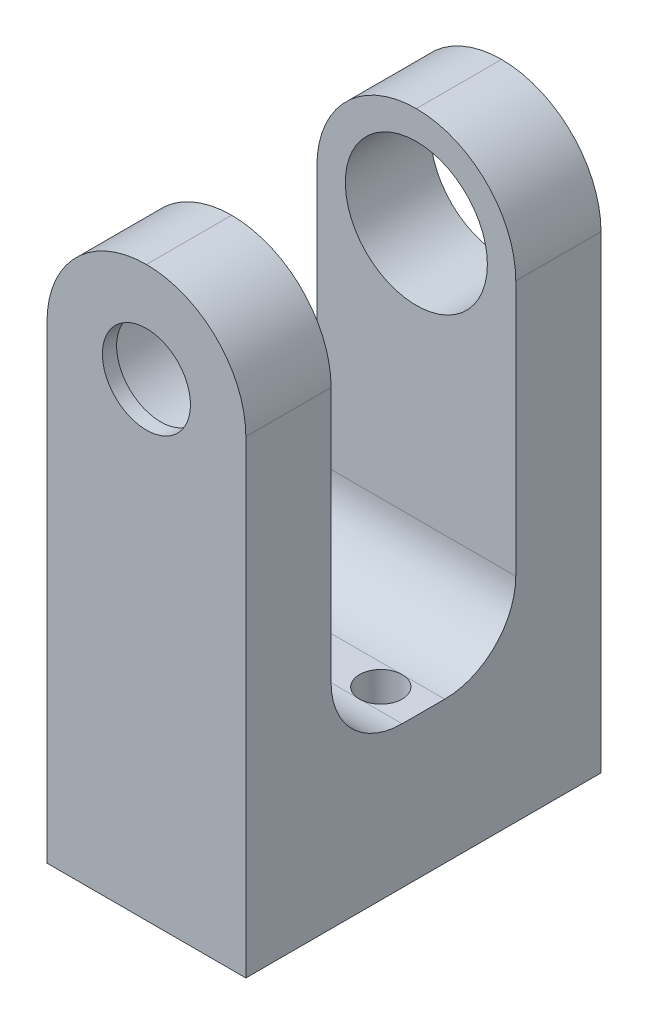
ISO-10303-21;
HEADER;
FILE_DESCRIPTION(('STEP AP214'),'2;1');
FILE_NAME('part.step','',(''),(''),'','','');
FILE_SCHEMA(('AUTOMOTIVE_DESIGN { 1 0 10303 214 1 1 1 1 }'));
ENDSEC;
DATA;
#1=APPLICATION_CONTEXT('core data for automotive mechanical design processes');
#2=APPLICATION_PROTOCOL_DEFINITION('international standard','automotive_design',2000,#1);
#3=PRODUCT_CONTEXT('',#1,'mechanical');
#4=PRODUCT('Part','Part','',(#3));
#5=PRODUCT_RELATED_PRODUCT_CATEGORY('part','',(#4));
#6=PRODUCT_DEFINITION_FORMATION('','',#4);
#7=PRODUCT_DEFINITION_CONTEXT('part definition',#1,'design');
#8=PRODUCT_DEFINITION('design','',#6,#7);
#9=PRODUCT_DEFINITION_SHAPE('','',#8);
#10=(LENGTH_UNIT() NAMED_UNIT(*) SI_UNIT(.MILLI.,.METRE.));
#11=(NAMED_UNIT(*) PLANE_ANGLE_UNIT() SI_UNIT($,.RADIAN.));
#12=(NAMED_UNIT(*) SI_UNIT($,.STERADIAN.) SOLID_ANGLE_UNIT());
#13=UNCERTAINTY_MEASURE_WITH_UNIT(LENGTH_MEASURE(1.E-05),#10,'distance_accuracy_value','');
#14=(GEOMETRIC_REPRESENTATION_CONTEXT(3) GLOBAL_UNCERTAINTY_ASSIGNED_CONTEXT((#13)) GLOBAL_UNIT_ASSIGNED_CONTEXT((#10,
#11,#12)) REPRESENTATION_CONTEXT('',''));
#15=CARTESIAN_POINT('',(0.,0.,0.));
#16=DIRECTION('',(0.,0.,1.));
#17=DIRECTION('',(1.,0.,0.));
#18=AXIS2_PLACEMENT_3D('',#15,#16,#17);
#19=CARTESIAN_POINT('',(14.,10.,-1.5));
#20=DIRECTION('',(0.,-1.,0.));
#21=DIRECTION('',(0.,0.,-1.));
#22=AXIS2_PLACEMENT_3D('',#19,#20,#21);
#23=PLANE('',#22);
#24=DIRECTION('',(-1.,0.,0.));
#25=VECTOR('',#24,1.);
#26=CARTESIAN_POINT('',(14.,10.,-1.5));
#27=LINE('',#26,#25);
#28=CARTESIAN_POINT('',(11.,10.,-1.5));
#29=VERTEX_POINT('',#28);
#30=CARTESIAN_POINT('',(3.,10.,-1.5));
#31=VERTEX_POINT('',#30);
#32=EDGE_CURVE('E162',#29,#31,#27,.T.);
#33=ORIENTED_EDGE('',*,*,#32,.T.);
#34=CARTESIAN_POINT('',(3.,10.,0.));
#35=DIRECTION('',(0.,1.,0.));
#36=DIRECTION('',(0.,0.,1.));
#37=AXIS2_PLACEMENT_3D('',#34,#35,#36);
#38=CIRCLE('',#37,1.5);
#39=CARTESIAN_POINT('',(3.,10.,1.5));
#40=VERTEX_POINT('',#39);
#41=EDGE_CURVE('E50',#40,#31,#38,.T.);
#42=ORIENTED_EDGE('',*,*,#41,.F.);
#43=DIRECTION('',(-1.,0.,0.));
#44=VECTOR('',#43,1.);
#45=CARTESIAN_POINT('',(14.,10.,1.5));
#46=LINE('',#45,#44);
#47=CARTESIAN_POINT('',(11.,10.,1.5));
#48=VERTEX_POINT('',#47);
#49=EDGE_CURVE('E153',#48,#40,#46,.T.);
#50=ORIENTED_EDGE('',*,*,#49,.F.);
#51=CARTESIAN_POINT('',(11.,10.,0.));
#52=DIRECTION('',(0.,1.,0.));
#53=DIRECTION('',(0.,0.,1.));
#54=AXIS2_PLACEMENT_3D('',#51,#52,#53);
#55=CIRCLE('',#54,1.5);
#56=EDGE_CURVE('E133',#29,#48,#55,.T.);
#57=ORIENTED_EDGE('',*,*,#56,.F.);
#58=EDGE_LOOP('',(#33,#42,#50,#57));
#59=FACE_BOUND('',#58,.T.);
#60=ADVANCED_FACE('F34',(#59),#23,.F.);
#61=CARTESIAN_POINT('',(14.,10.,-1.5));
#62=VERTEX_POINT('',#61);
#63=EDGE_CURVE('E150',#62,#29,#27,.T.);
#64=ORIENTED_EDGE('',*,*,#63,.T.);
#65=EDGE_CURVE('E57',#48,#29,#55,.T.);
#66=ORIENTED_EDGE('',*,*,#65,.F.);
#67=CARTESIAN_POINT('',(14.,10.,1.5));
#68=VERTEX_POINT('',#67);
#69=EDGE_CURVE('E147',#68,#48,#46,.T.);
#70=ORIENTED_EDGE('',*,*,#69,.F.);
#71=DIRECTION('',(0.,0.,1.));
#72=VECTOR('',#71,1.);
#73=CARTESIAN_POINT('',(14.,10.,-1.5));
#74=LINE('',#73,#72);
#75=EDGE_CURVE('E202',#62,#68,#74,.T.);
#76=ORIENTED_EDGE('',*,*,#75,.F.);
#77=EDGE_LOOP('',(#64,#66,#70,#76));
#78=FACE_BOUND('',#77,.T.);
#79=ADVANCED_FACE('F144',(#78),#23,.F.);
#80=CARTESIAN_POINT('',(14.,0.,0.));
#81=DIRECTION('',(0.,1.,0.));
#82=DIRECTION('',(0.,0.,1.));
#83=AXIS2_PLACEMENT_3D('',#80,#81,#82);
#84=PLANE('',#83);
#85=CARTESIAN_POINT('',(3.,0.,0.));
#86=DIRECTION('',(0.,1.,0.));
#87=DIRECTION('',(0.,0.,1.));
#88=AXIS2_PLACEMENT_3D('',#85,#86,#87);
#89=CIRCLE('',#88,1.5);
#90=CARTESIAN_POINT('',(3.,0.,1.5));
#91=VERTEX_POINT('',#90);
#92=EDGE_CURVE('E226',#91,#91,#89,.T.);
#93=ORIENTED_EDGE('',*,*,#92,.T.);
#94=EDGE_LOOP('',(#93));
#95=FACE_BOUND('',#94,.T.);
#96=CARTESIAN_POINT('',(11.,0.,0.));
#97=DIRECTION('',(0.,1.,0.));
#98=DIRECTION('',(0.,0.,1.));
#99=AXIS2_PLACEMENT_3D('',#96,#97,#98);
#100=CIRCLE('',#99,1.5);
#101=CARTESIAN_POINT('',(11.,0.,1.5));
#102=VERTEX_POINT('',#101);
#103=EDGE_CURVE('E229',#102,#102,#100,.T.);
#104=ORIENTED_EDGE('',*,*,#103,.T.);
#105=EDGE_LOOP('',(#104));
#106=FACE_BOUND('',#105,.T.);
#107=DIRECTION('',(0.,0.,-1.));
#108=VECTOR('',#107,1.);
#109=CARTESIAN_POINT('',(0.,0.,0.));
#110=LINE('',#109,#108);
#111=CARTESIAN_POINT('',(0.,0.,12.5));
#112=VERTEX_POINT('',#111);
#113=CARTESIAN_POINT('',(0.,0.,-12.5));
#114=VERTEX_POINT('',#113);
#115=EDGE_CURVE('E194',#112,#114,#110,.T.);
#116=ORIENTED_EDGE('',*,*,#115,.T.);
#117=DIRECTION('',(-1.,0.,0.));
#118=VECTOR('',#117,1.);
#119=CARTESIAN_POINT('',(14.,0.,-12.5));
#120=LINE('',#119,#118);
#121=CARTESIAN_POINT('',(14.,0.,-12.5));
#122=VERTEX_POINT('',#121);
#123=EDGE_CURVE('E245',#122,#114,#120,.T.);
#124=ORIENTED_EDGE('',*,*,#123,.F.);
#125=DIRECTION('',(0.,0.,-1.));
#126=VECTOR('',#125,1.);
#127=CARTESIAN_POINT('',(14.,0.,12.5));
#128=LINE('',#127,#126);
#129=CARTESIAN_POINT('',(14.,0.,12.5));
#130=VERTEX_POINT('',#129);
#131=EDGE_CURVE('E179',#130,#122,#128,.T.);
#132=ORIENTED_EDGE('',*,*,#131,.F.);
#133=DIRECTION('',(-1.,0.,0.));
#134=VECTOR('',#133,1.);
#135=CARTESIAN_POINT('',(14.,0.,12.5));
#136=LINE('',#135,#134);
#137=EDGE_CURVE('E168',#130,#112,#136,.T.);
#138=ORIENTED_EDGE('',*,*,#137,.T.);
#139=EDGE_LOOP('',(#116,#124,#132,#138));
#140=FACE_BOUND('',#139,.T.);
#141=ADVANCED_FACE('F300',(#95,#106,#140),#84,.F.);
#142=CARTESIAN_POINT('',(14.,0.,-12.5));
#143=DIRECTION('',(0.,0.,1.));
#144=DIRECTION('',(1.,0.,0.));
#145=AXIS2_PLACEMENT_3D('',#142,#143,#144);
#146=PLANE('',#145);
#147=CARTESIAN_POINT('',(7.,33.,-12.5));
#148=DIRECTION('',(0.,0.,1.));
#149=DIRECTION('',(1.,0.,0.));
#150=AXIS2_PLACEMENT_3D('',#147,#148,#149);
#151=CIRCLE('',#150,5.);
#152=CARTESIAN_POINT('',(12.,33.,-12.5));
#153=VERTEX_POINT('',#152);
#154=EDGE_CURVE('E212',#153,#153,#151,.T.);
#155=ORIENTED_EDGE('',*,*,#154,.T.);
#156=EDGE_LOOP('',(#155));
#157=FACE_BOUND('',#156,.T.);
#158=DIRECTION('',(0.,1.,0.));
#159=VECTOR('',#158,1.);
#160=CARTESIAN_POINT('',(0.,0.,-12.5));
#161=LINE('',#160,#159);
#162=CARTESIAN_POINT('',(0.,33.,-12.5));
#163=VERTEX_POINT('',#162);
#164=EDGE_CURVE('E191',#114,#163,#161,.T.);
#165=ORIENTED_EDGE('',*,*,#164,.T.);
#166=CARTESIAN_POINT('',(7.,33.,-12.5));
#167=DIRECTION('',(0.,0.,1.));
#168=DIRECTION('',(1.,0.,0.));
#169=AXIS2_PLACEMENT_3D('',#166,#167,#168);
#170=CIRCLE('',#169,7.);
#171=CARTESIAN_POINT('',(7.,40.,-12.5));
#172=VERTEX_POINT('',#171);
#173=EDGE_CURVE('E268',#163,#172,#170,.F.);
#174=ORIENTED_EDGE('',*,*,#173,.T.);
#175=CARTESIAN_POINT('',(7.,33.,-12.5));
#176=DIRECTION('',(0.,0.,1.));
#177=DIRECTION('',(1.,0.,0.));
#178=AXIS2_PLACEMENT_3D('',#175,#176,#177);
#179=CIRCLE('',#178,7.);
#180=CARTESIAN_POINT('',(14.,33.,-12.5));
#181=VERTEX_POINT('',#180);
#182=EDGE_CURVE('E266',#172,#181,#179,.F.);
#183=ORIENTED_EDGE('',*,*,#182,.T.);
#184=DIRECTION('',(0.,1.,0.));
#185=VECTOR('',#184,1.);
#186=CARTESIAN_POINT('',(14.,0.,-12.5));
#187=LINE('',#186,#185);
#188=EDGE_CURVE('E208',#122,#181,#187,.T.);
#189=ORIENTED_EDGE('',*,*,#188,.F.);
#190=ORIENTED_EDGE('',*,*,#123,.T.);
#191=EDGE_LOOP('',(#165,#174,#183,#189,#190));
#192=FACE_BOUND('',#191,.T.);
#193=ADVANCED_FACE('F312',(#157,#192),#146,.F.);
#194=CARTESIAN_POINT('',(14.,40.,-6.5));
#195=DIRECTION('',(0.,0.,-1.));
#196=DIRECTION('',(0.,1.,0.));
#197=AXIS2_PLACEMENT_3D('',#194,#195,#196);
#198=PLANE('',#197);
#199=CARTESIAN_POINT('',(7.,33.,-6.5));
#200=DIRECTION('',(0.,0.,-1.));
#201=DIRECTION('',(0.,1.,0.));
#202=AXIS2_PLACEMENT_3D('',#199,#200,#201);
#203=CIRCLE('',#202,5.);
#204=CARTESIAN_POINT('',(7.,38.,-6.5));
#205=VERTEX_POINT('',#204);
#206=EDGE_CURVE('E216',#205,#205,#203,.T.);
#207=ORIENTED_EDGE('',*,*,#206,.T.);
#208=EDGE_LOOP('',(#207));
#209=FACE_BOUND('',#208,.T.);
#210=CARTESIAN_POINT('',(7.,33.,-6.5));
#211=DIRECTION('',(0.,0.,-1.));
#212=DIRECTION('',(0.,1.,0.));
#213=AXIS2_PLACEMENT_3D('',#210,#211,#212);
#214=CIRCLE('',#213,7.);
#215=CARTESIAN_POINT('',(14.,33.,-6.5));
#216=VERTEX_POINT('',#215);
#217=CARTESIAN_POINT('',(7.,40.,-6.5));
#218=VERTEX_POINT('',#217);
#219=EDGE_CURVE('E262',#216,#218,#214,.F.);
#220=ORIENTED_EDGE('',*,*,#219,.T.);
#221=CARTESIAN_POINT('',(7.,33.,-6.5));
#222=DIRECTION('',(0.,0.,-1.));
#223=DIRECTION('',(0.,1.,0.));
#224=AXIS2_PLACEMENT_3D('',#221,#222,#223);
#225=CIRCLE('',#224,7.);
#226=CARTESIAN_POINT('',(0.,33.,-6.5));
#227=VERTEX_POINT('',#226);
#228=EDGE_CURVE('E264',#218,#227,#225,.F.);
#229=ORIENTED_EDGE('',*,*,#228,.T.);
#230=DIRECTION('',(0.,-1.,0.));
#231=VECTOR('',#230,1.);
#232=CARTESIAN_POINT('',(0.,40.,-6.5));
#233=LINE('',#232,#231);
#234=CARTESIAN_POINT('',(0.,15.,-6.5));
#235=VERTEX_POINT('',#234);
#236=EDGE_CURVE('E189',#227,#235,#233,.T.);
#237=ORIENTED_EDGE('',*,*,#236,.T.);
#238=DIRECTION('',(-1.,0.,0.));
#239=VECTOR('',#238,1.);
#240=CARTESIAN_POINT('',(14.,15.,-6.5));
#241=LINE('',#240,#239);
#242=CARTESIAN_POINT('',(14.,15.,-6.5));
#243=VERTEX_POINT('',#242);
#244=EDGE_CURVE('E242',#243,#235,#241,.T.);
#245=ORIENTED_EDGE('',*,*,#244,.F.);
#246=DIRECTION('',(0.,-1.,0.));
#247=VECTOR('',#246,1.);
#248=CARTESIAN_POINT('',(14.,40.,-6.5));
#249=LINE('',#248,#247);
#250=EDGE_CURVE('E206',#216,#243,#249,.T.);
#251=ORIENTED_EDGE('',*,*,#250,.F.);
#252=EDGE_LOOP('',(#220,#229,#237,#245,#251));
#253=FACE_BOUND('',#252,.T.);
#254=ADVANCED_FACE('F308',(#209,#253),#198,.F.);
#255=CARTESIAN_POINT('',(14.,15.,-1.5));
#256=DIRECTION('',(-1.,0.,0.));
#257=DIRECTION('',(0.,0.,1.));
#258=AXIS2_PLACEMENT_3D('',#255,#256,#257);
#259=CYLINDRICAL_SURFACE('',#258,5.);
#260=CARTESIAN_POINT('',(0.,15.,-1.5));
#261=DIRECTION('',(-1.,0.,0.));
#262=DIRECTION('',(0.,0.,1.));
#263=AXIS2_PLACEMENT_3D('',#260,#261,#262);
#264=CIRCLE('',#263,5.);
#265=CARTESIAN_POINT('',(0.,10.,-1.5));
#266=VERTEX_POINT('',#265);
#267=EDGE_CURVE('E186',#235,#266,#264,.T.);
#268=ORIENTED_EDGE('',*,*,#267,.T.);
#269=EDGE_CURVE('E161',#31,#266,#27,.T.);
#270=ORIENTED_EDGE('',*,*,#269,.F.);
#271=ORIENTED_EDGE('',*,*,#32,.F.);
#272=ORIENTED_EDGE('',*,*,#63,.F.);
#273=CARTESIAN_POINT('',(14.,15.,-1.5));
#274=DIRECTION('',(-1.,0.,0.));
#275=DIRECTION('',(0.,0.,1.));
#276=AXIS2_PLACEMENT_3D('',#273,#274,#275);
#277=CIRCLE('',#276,5.);
#278=EDGE_CURVE('E204',#243,#62,#277,.T.);
#279=ORIENTED_EDGE('',*,*,#278,.F.);
#280=ORIENTED_EDGE('',*,*,#244,.T.);
#281=EDGE_LOOP('',(#268,#270,#271,#272,#279,#280));
#282=FACE_BOUND('',#281,.T.);
#283=ADVANCED_FACE('F238',(#282),#259,.F.);
#284=CARTESIAN_POINT('',(0.,10.,1.5));
#285=VERTEX_POINT('',#284);
#286=EDGE_CURVE('E156',#40,#285,#46,.T.);
#287=ORIENTED_EDGE('',*,*,#286,.F.);
#288=EDGE_CURVE('E151',#31,#40,#38,.T.);
#289=ORIENTED_EDGE('',*,*,#288,.F.);
#290=ORIENTED_EDGE('',*,*,#269,.T.);
#291=DIRECTION('',(0.,0.,1.));
#292=VECTOR('',#291,1.);
#293=CARTESIAN_POINT('',(0.,10.,-1.5));
#294=LINE('',#293,#292);
#295=EDGE_CURVE('E184',#266,#285,#294,.T.);
#296=ORIENTED_EDGE('',*,*,#295,.T.);
#297=EDGE_LOOP('',(#287,#289,#290,#296));
#298=FACE_BOUND('',#297,.T.);
#299=ADVANCED_FACE('F236',(#298),#23,.F.);
#300=CARTESIAN_POINT('',(14.,15.,1.5));
#301=DIRECTION('',(-1.,0.,0.));
#302=DIRECTION('',(0.,0.,1.));
#303=AXIS2_PLACEMENT_3D('',#300,#301,#302);
#304=CYLINDRICAL_SURFACE('',#303,5.);
#305=CARTESIAN_POINT('',(0.,15.,1.5));
#306=DIRECTION('',(-1.,0.,0.));
#307=DIRECTION('',(0.,0.,1.));
#308=AXIS2_PLACEMENT_3D('',#305,#306,#307);
#309=CIRCLE('',#308,5.);
#310=CARTESIAN_POINT('',(0.,15.,6.5));
#311=VERTEX_POINT('',#310);
#312=EDGE_CURVE('E182',#285,#311,#309,.T.);
#313=ORIENTED_EDGE('',*,*,#312,.T.);
#314=DIRECTION('',(-1.,0.,0.));
#315=VECTOR('',#314,1.);
#316=CARTESIAN_POINT('',(14.,15.,6.5));
#317=LINE('',#316,#315);
#318=CARTESIAN_POINT('',(14.,15.,6.5));
#319=VERTEX_POINT('',#318);
#320=EDGE_CURVE('E165',#319,#311,#317,.T.);
#321=ORIENTED_EDGE('',*,*,#320,.F.);
#322=CARTESIAN_POINT('',(14.,15.,1.5));
#323=DIRECTION('',(-1.,0.,0.));
#324=DIRECTION('',(0.,0.,1.));
#325=AXIS2_PLACEMENT_3D('',#322,#323,#324);
#326=CIRCLE('',#325,5.);
#327=EDGE_CURVE('E160',#68,#319,#326,.T.);
#328=ORIENTED_EDGE('',*,*,#327,.F.);
#329=ORIENTED_EDGE('',*,*,#69,.T.);
#330=ORIENTED_EDGE('',*,*,#49,.T.);
#331=ORIENTED_EDGE('',*,*,#286,.T.);
#332=EDGE_LOOP('',(#313,#321,#328,#329,#330,#331));
#333=FACE_BOUND('',#332,.T.);
#334=ADVANCED_FACE('F158',(#333),#304,.F.);
#335=CARTESIAN_POINT('',(14.,15.,6.5));
#336=DIRECTION('',(0.,0.,1.));
#337=DIRECTION('',(0.,-1.,0.));
#338=AXIS2_PLACEMENT_3D('',#335,#336,#337);
#339=PLANE('',#338);
#340=CARTESIAN_POINT('',(7.,33.,6.5));
#341=DIRECTION('',(0.,0.,1.));
#342=DIRECTION('',(0.,-1.,0.));
#343=AXIS2_PLACEMENT_3D('',#340,#341,#342);
#344=CIRCLE('',#343,5.);
#345=CARTESIAN_POINT('',(7.,28.,6.5));
#346=VERTEX_POINT('',#345);
#347=EDGE_CURVE('E219',#346,#346,#344,.T.);
#348=ORIENTED_EDGE('',*,*,#347,.T.);
#349=EDGE_LOOP('',(#348));
#350=FACE_BOUND('',#349,.T.);
#351=DIRECTION('',(0.,1.,0.));
#352=VECTOR('',#351,1.);
#353=CARTESIAN_POINT('',(0.,15.,6.5));
#354=LINE('',#353,#352);
#355=CARTESIAN_POINT('',(0.,33.,6.5));
#356=VERTEX_POINT('',#355);
#357=EDGE_CURVE('E180',#311,#356,#354,.T.);
#358=ORIENTED_EDGE('',*,*,#357,.T.);
#359=CARTESIAN_POINT('',(7.,33.,6.5));
#360=DIRECTION('',(0.,0.,1.));
#361=DIRECTION('',(0.,-1.,0.));
#362=AXIS2_PLACEMENT_3D('',#359,#360,#361);
#363=CIRCLE('',#362,7.);
#364=CARTESIAN_POINT('',(7.,40.,6.5));
#365=VERTEX_POINT('',#364);
#366=EDGE_CURVE('E260',#356,#365,#363,.F.);
#367=ORIENTED_EDGE('',*,*,#366,.T.);
#368=CARTESIAN_POINT('',(7.,33.,6.5));
#369=DIRECTION('',(0.,0.,1.));
#370=DIRECTION('',(0.,-1.,0.));
#371=AXIS2_PLACEMENT_3D('',#368,#369,#370);
#372=CIRCLE('',#371,7.);
#373=CARTESIAN_POINT('',(14.,33.,6.5));
#374=VERTEX_POINT('',#373);
#375=EDGE_CURVE('E258',#365,#374,#372,.F.);
#376=ORIENTED_EDGE('',*,*,#375,.T.);
#377=DIRECTION('',(0.,1.,0.));
#378=VECTOR('',#377,1.);
#379=CARTESIAN_POINT('',(14.,15.,6.5));
#380=LINE('',#379,#378);
#381=EDGE_CURVE('E198',#319,#374,#380,.T.);
#382=ORIENTED_EDGE('',*,*,#381,.F.);
#383=ORIENTED_EDGE('',*,*,#320,.T.);
#384=EDGE_LOOP('',(#358,#367,#376,#382,#383));
#385=FACE_BOUND('',#384,.T.);
#386=ADVANCED_FACE('F277',(#350,#385),#339,.F.);
#387=CARTESIAN_POINT('',(14.,40.,12.5));
#388=DIRECTION('',(0.,0.,-1.));
#389=DIRECTION('',(0.,1.,0.));
#390=AXIS2_PLACEMENT_3D('',#387,#388,#389);
#391=PLANE('',#390);
#392=CARTESIAN_POINT('',(7.,33.,12.5));
#393=DIRECTION('',(0.,0.,1.));
#394=DIRECTION('',(1.,0.,0.));
#395=AXIS2_PLACEMENT_3D('',#392,#393,#394);
#396=CIRCLE('',#395,3.1);
#397=CARTESIAN_POINT('',(10.1,33.,12.5));
#398=VERTEX_POINT('',#397);
#399=EDGE_CURVE('E223',#398,#398,#396,.T.);
#400=ORIENTED_EDGE('',*,*,#399,.F.);
#401=EDGE_LOOP('',(#400));
#402=FACE_BOUND('',#401,.T.);
#403=CARTESIAN_POINT('',(7.,33.,12.5));
#404=DIRECTION('',(0.,0.,-1.));
#405=DIRECTION('',(0.,1.,0.));
#406=AXIS2_PLACEMENT_3D('',#403,#404,#405);
#407=CIRCLE('',#406,7.);
#408=CARTESIAN_POINT('',(14.,33.,12.5));
#409=VERTEX_POINT('',#408);
#410=CARTESIAN_POINT('',(7.,40.,12.5));
#411=VERTEX_POINT('',#410);
#412=EDGE_CURVE('E248',#409,#411,#407,.F.);
#413=ORIENTED_EDGE('',*,*,#412,.T.);
#414=CARTESIAN_POINT('',(7.,33.,12.5));
#415=DIRECTION('',(0.,0.,-1.));
#416=DIRECTION('',(0.,1.,0.));
#417=AXIS2_PLACEMENT_3D('',#414,#415,#416);
#418=CIRCLE('',#417,7.);
#419=CARTESIAN_POINT('',(0.,33.,12.5));
#420=VERTEX_POINT('',#419);
#421=EDGE_CURVE('E250',#411,#420,#418,.F.);
#422=ORIENTED_EDGE('',*,*,#421,.T.);
#423=DIRECTION('',(0.,-1.,0.));
#424=VECTOR('',#423,1.);
#425=CARTESIAN_POINT('',(0.,40.,12.5));
#426=LINE('',#425,#424);
#427=EDGE_CURVE('E177',#420,#112,#426,.T.);
#428=ORIENTED_EDGE('',*,*,#427,.T.);
#429=ORIENTED_EDGE('',*,*,#137,.F.);
#430=DIRECTION('',(0.,-1.,0.));
#431=VECTOR('',#430,1.);
#432=CARTESIAN_POINT('',(14.,40.,12.5));
#433=LINE('',#432,#431);
#434=EDGE_CURVE('E174',#409,#130,#433,.T.);
#435=ORIENTED_EDGE('',*,*,#434,.F.);
#436=EDGE_LOOP('',(#413,#422,#428,#429,#435));
#437=FACE_BOUND('',#436,.T.);
#438=ADVANCED_FACE('F361',(#402,#437),#391,.F.);
#439=CARTESIAN_POINT('',(14.,15.,-1.5));
#440=DIRECTION('',(-1.,0.,0.));
#441=DIRECTION('',(0.,0.,1.));
#442=AXIS2_PLACEMENT_3D('',#439,#440,#441);
#443=PLANE('',#442);
#444=ORIENTED_EDGE('',*,*,#188,.T.);
#445=DIRECTION('',(0.,0.,1.));
#446=VECTOR('',#445,1.);
#447=CARTESIAN_POINT('',(14.,33.,-1.5));
#448=LINE('',#447,#446);
#449=EDGE_CURVE('E11',#181,#216,#448,.T.);
#450=ORIENTED_EDGE('',*,*,#449,.T.);
#451=ORIENTED_EDGE('',*,*,#250,.T.);
#452=ORIENTED_EDGE('',*,*,#278,.T.);
#453=ORIENTED_EDGE('',*,*,#75,.T.);
#454=ORIENTED_EDGE('',*,*,#327,.T.);
#455=ORIENTED_EDGE('',*,*,#381,.T.);
#456=DIRECTION('',(0.,0.,1.));
#457=VECTOR('',#456,1.);
#458=CARTESIAN_POINT('',(14.,33.,-1.5));
#459=LINE('',#458,#457);
#460=EDGE_CURVE('E43',#374,#409,#459,.T.);
#461=ORIENTED_EDGE('',*,*,#460,.T.);
#462=ORIENTED_EDGE('',*,*,#434,.T.);
#463=ORIENTED_EDGE('',*,*,#131,.T.);
#464=EDGE_LOOP('',(#444,#450,#451,#452,#453,#454,#455,#461,#462,#463));
#465=FACE_BOUND('',#464,.T.);
#466=ADVANCED_FACE('F360',(#465),#443,.F.);
#467=CARTESIAN_POINT('',(0.,15.,-1.5));
#468=DIRECTION('',(-1.,0.,0.));
#469=DIRECTION('',(0.,0.,1.));
#470=AXIS2_PLACEMENT_3D('',#467,#468,#469);
#471=PLANE('',#470);
#472=ORIENTED_EDGE('',*,*,#427,.F.);
#473=DIRECTION('',(0.,0.,1.));
#474=VECTOR('',#473,1.);
#475=CARTESIAN_POINT('',(0.,33.,6.5));
#476=LINE('',#475,#474);
#477=EDGE_CURVE('E255',#420,#356,#476,.F.);
#478=ORIENTED_EDGE('',*,*,#477,.T.);
#479=ORIENTED_EDGE('',*,*,#357,.F.);
#480=ORIENTED_EDGE('',*,*,#312,.F.);
#481=ORIENTED_EDGE('',*,*,#295,.F.);
#482=ORIENTED_EDGE('',*,*,#267,.F.);
#483=ORIENTED_EDGE('',*,*,#236,.F.);
#484=DIRECTION('',(0.,0.,1.));
#485=VECTOR('',#484,1.);
#486=CARTESIAN_POINT('',(0.,33.,-12.5));
#487=LINE('',#486,#485);
#488=EDGE_CURVE('E252',#227,#163,#487,.F.);
#489=ORIENTED_EDGE('',*,*,#488,.T.);
#490=ORIENTED_EDGE('',*,*,#164,.F.);
#491=ORIENTED_EDGE('',*,*,#115,.F.);
#492=EDGE_LOOP('',(#472,#478,#479,#480,#481,#482,#483,#489,#490,#491));
#493=FACE_BOUND('',#492,.T.);
#494=ADVANCED_FACE('F328',(#493),#471,.T.);
#495=CARTESIAN_POINT('',(7.,33.,-1.5));
#496=DIRECTION('',(0.,0.,1.));
#497=DIRECTION('',(1.,0.,0.));
#498=AXIS2_PLACEMENT_3D('',#495,#496,#497);
#499=CYLINDRICAL_SURFACE('',#498,7.);
#500=ORIENTED_EDGE('',*,*,#460,.F.);
#501=ORIENTED_EDGE('',*,*,#375,.F.);
#502=DIRECTION('',(0.,0.,1.));
#503=VECTOR('',#502,1.);
#504=CARTESIAN_POINT('',(7.,40.,6.5));
#505=LINE('',#504,#503);
#506=EDGE_CURVE('E196',#411,#365,#505,.F.);
#507=ORIENTED_EDGE('',*,*,#506,.F.);
#508=ORIENTED_EDGE('',*,*,#412,.F.);
#509=EDGE_LOOP('',(#500,#501,#507,#508));
#510=FACE_BOUND('',#509,.T.);
#511=ADVANCED_FACE('F325',(#510),#499,.T.);
#512=CARTESIAN_POINT('',(7.,33.,6.5));
#513=DIRECTION('',(0.,0.,-1.));
#514=DIRECTION('',(-1.,0.,0.));
#515=AXIS2_PLACEMENT_3D('',#512,#513,#514);
#516=CYLINDRICAL_SURFACE('',#515,7.);
#517=ORIENTED_EDGE('',*,*,#366,.F.);
#518=ORIENTED_EDGE('',*,*,#477,.F.);
#519=ORIENTED_EDGE('',*,*,#421,.F.);
#520=ORIENTED_EDGE('',*,*,#506,.T.);
#521=EDGE_LOOP('',(#517,#518,#519,#520));
#522=FACE_BOUND('',#521,.T.);
#523=ADVANCED_FACE('F322',(#522),#516,.T.);
#524=CARTESIAN_POINT('',(7.,33.,-1.5));
#525=DIRECTION('',(0.,0.,1.));
#526=DIRECTION('',(1.,0.,0.));
#527=AXIS2_PLACEMENT_3D('',#524,#525,#526);
#528=CYLINDRICAL_SURFACE('',#527,7.);
#529=ORIENTED_EDGE('',*,*,#449,.F.);
#530=ORIENTED_EDGE('',*,*,#182,.F.);
#531=DIRECTION('',(0.,0.,1.));
#532=VECTOR('',#531,1.);
#533=CARTESIAN_POINT('',(7.,40.,-12.5));
#534=LINE('',#533,#532);
#535=EDGE_CURVE('E215',#218,#172,#534,.F.);
#536=ORIENTED_EDGE('',*,*,#535,.F.);
#537=ORIENTED_EDGE('',*,*,#219,.F.);
#538=EDGE_LOOP('',(#529,#530,#536,#537));
#539=FACE_BOUND('',#538,.T.);
#540=ADVANCED_FACE('F36',(#539),#528,.T.);
#541=CARTESIAN_POINT('',(7.,33.,-12.5));
#542=DIRECTION('',(0.,0.,-1.));
#543=DIRECTION('',(-1.,0.,0.));
#544=AXIS2_PLACEMENT_3D('',#541,#542,#543);
#545=CYLINDRICAL_SURFACE('',#544,7.);
#546=ORIENTED_EDGE('',*,*,#173,.F.);
#547=ORIENTED_EDGE('',*,*,#488,.F.);
#548=ORIENTED_EDGE('',*,*,#228,.F.);
#549=ORIENTED_EDGE('',*,*,#535,.T.);
#550=EDGE_LOOP('',(#546,#547,#548,#549));
#551=FACE_BOUND('',#550,.T.);
#552=ADVANCED_FACE('F291',(#551),#545,.T.);
#553=CARTESIAN_POINT('',(7.,33.,11.5));
#554=DIRECTION('',(0.,0.,1.));
#555=DIRECTION('',(1.,0.,0.));
#556=AXIS2_PLACEMENT_3D('',#553,#554,#555);
#557=PLANE('',#556);
#558=CARTESIAN_POINT('',(7.,33.,11.5));
#559=DIRECTION('',(0.,0.,1.));
#560=DIRECTION('',(1.,0.,0.));
#561=AXIS2_PLACEMENT_3D('',#558,#559,#560);
#562=CIRCLE('',#561,3.1);
#563=CARTESIAN_POINT('',(10.1,33.,11.5));
#564=VERTEX_POINT('',#563);
#565=EDGE_CURVE('E38',#564,#564,#562,.T.);
#566=ORIENTED_EDGE('',*,*,#565,.T.);
#567=EDGE_LOOP('',(#566));
#568=FACE_BOUND('',#567,.T.);
#569=CARTESIAN_POINT('',(7.,33.,11.5));
#570=DIRECTION('',(0.,0.,1.));
#571=DIRECTION('',(1.,0.,0.));
#572=AXIS2_PLACEMENT_3D('',#569,#570,#571);
#573=CIRCLE('',#572,5.);
#574=CARTESIAN_POINT('',(12.,33.,11.5));
#575=VERTEX_POINT('',#574);
#576=EDGE_CURVE('E220',#575,#575,#573,.T.);
#577=ORIENTED_EDGE('',*,*,#576,.F.);
#578=EDGE_LOOP('',(#577));
#579=FACE_BOUND('',#578,.T.);
#580=ADVANCED_FACE('F282',(#568,#579),#557,.F.);
#581=CARTESIAN_POINT('',(7.,33.,-19.5));
#582=DIRECTION('',(0.,0.,1.));
#583=DIRECTION('',(1.,0.,0.));
#584=AXIS2_PLACEMENT_3D('',#581,#582,#583);
#585=CYLINDRICAL_SURFACE('',#584,5.);
#586=ORIENTED_EDGE('',*,*,#576,.T.);
#587=EDGE_LOOP('',(#586));
#588=FACE_BOUND('',#587,.T.);
#589=ORIENTED_EDGE('',*,*,#347,.F.);
#590=EDGE_LOOP('',(#589));
#591=FACE_BOUND('',#590,.T.);
#592=ADVANCED_FACE('F279',(#588,#591),#585,.F.);
#593=ORIENTED_EDGE('',*,*,#206,.F.);
#594=EDGE_LOOP('',(#593));
#595=FACE_BOUND('',#594,.T.);
#596=ORIENTED_EDGE('',*,*,#154,.F.);
#597=EDGE_LOOP('',(#596));
#598=FACE_BOUND('',#597,.T.);
#599=ADVANCED_FACE('F281',(#595,#598),#585,.F.);
#600=CARTESIAN_POINT('',(7.,33.,-22.5));
#601=DIRECTION('',(0.,0.,1.));
#602=DIRECTION('',(1.,0.,0.));
#603=AXIS2_PLACEMENT_3D('',#600,#601,#602);
#604=CYLINDRICAL_SURFACE('',#603,3.1);
#605=ORIENTED_EDGE('',*,*,#399,.T.);
#606=EDGE_LOOP('',(#605));
#607=FACE_BOUND('',#606,.T.);
#608=ORIENTED_EDGE('',*,*,#565,.F.);
#609=EDGE_LOOP('',(#608));
#610=FACE_BOUND('',#609,.T.);
#611=ADVANCED_FACE('F289',(#607,#610),#604,.F.);
#612=CARTESIAN_POINT('',(11.,-10.,0.));
#613=DIRECTION('',(0.,1.,0.));
#614=DIRECTION('',(0.,0.,1.));
#615=AXIS2_PLACEMENT_3D('',#612,#613,#614);
#616=CYLINDRICAL_SURFACE('',#615,1.5);
#617=ORIENTED_EDGE('',*,*,#65,.T.);
#618=ORIENTED_EDGE('',*,*,#56,.T.);
#619=EDGE_LOOP('',(#617,#618));
#620=FACE_BOUND('',#619,.T.);
#621=ORIENTED_EDGE('',*,*,#103,.F.);
#622=EDGE_LOOP('',(#621));
#623=FACE_BOUND('',#622,.T.);
#624=ADVANCED_FACE('F134',(#620,#623),#616,.F.);
#625=CARTESIAN_POINT('',(3.,-10.,0.));
#626=DIRECTION('',(0.,1.,0.));
#627=DIRECTION('',(0.,0.,1.));
#628=AXIS2_PLACEMENT_3D('',#625,#626,#627);
#629=CYLINDRICAL_SURFACE('',#628,1.5);
#630=ORIENTED_EDGE('',*,*,#41,.T.);
#631=ORIENTED_EDGE('',*,*,#288,.T.);
#632=EDGE_LOOP('',(#630,#631));
#633=FACE_BOUND('',#632,.T.);
#634=ORIENTED_EDGE('',*,*,#92,.F.);
#635=EDGE_LOOP('',(#634));
#636=FACE_BOUND('',#635,.T.);
#637=ADVANCED_FACE('F232',(#633,#636),#629,.F.);
#638=CLOSED_SHELL('',(#60,#79,#141,#193,#254,#283,#299,#334,#386,#438,#466,#494,#511,#523,#540,
#552,#580,#592,#599,#611,#624,#637));
#639=MANIFOLD_SOLID_BREP('B2',#638);
#640=ADVANCED_BREP_SHAPE_REPRESENTATION('',(#18,#639),#14);
#641=SHAPE_DEFINITION_REPRESENTATION(#9,#640);
ENDSEC;
END-ISO-10303-21;
